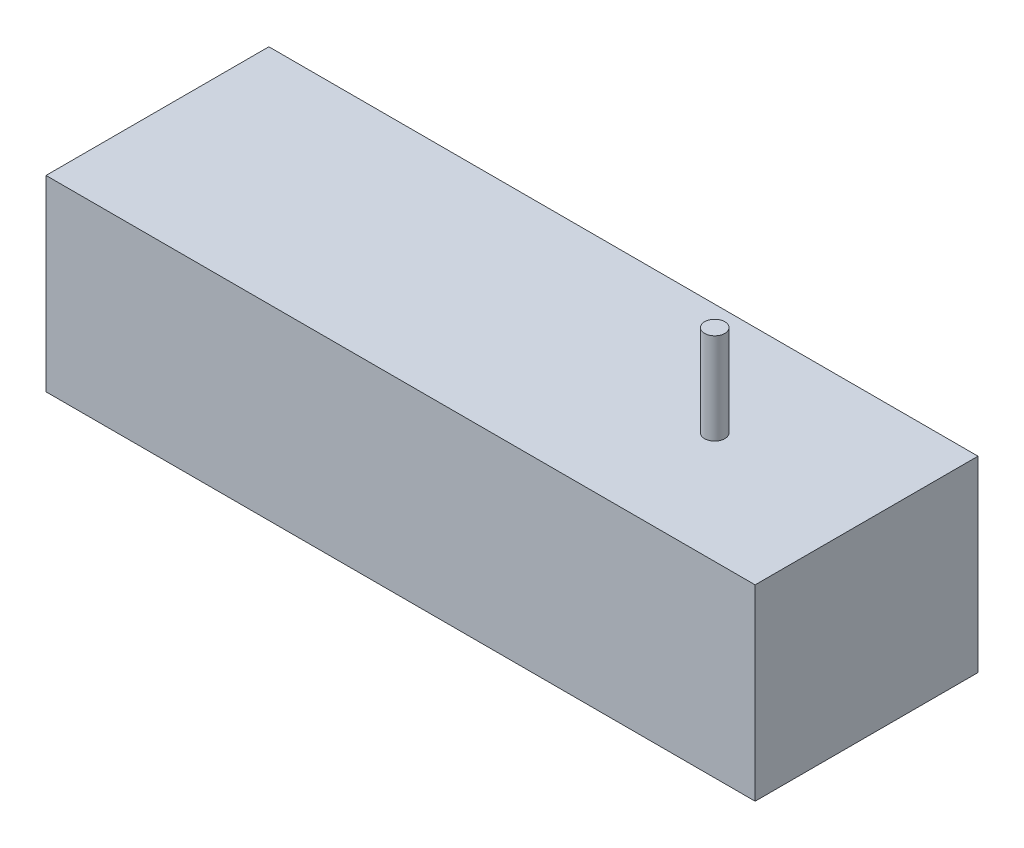
ISO-10303-21;
HEADER;
FILE_DESCRIPTION(('STEP AP214'),'2;1');
FILE_NAME('part.step','',(''),(''),'','','');
FILE_SCHEMA(('AUTOMOTIVE_DESIGN { 1 0 10303 214 1 1 1 1 }'));
ENDSEC;
DATA;
#1=APPLICATION_CONTEXT('core data for automotive mechanical design processes');
#2=APPLICATION_PROTOCOL_DEFINITION('international standard','automotive_design',2000,#1);
#3=PRODUCT_CONTEXT('',#1,'mechanical');
#4=PRODUCT('Part','Part','',(#3));
#5=PRODUCT_RELATED_PRODUCT_CATEGORY('part','',(#4));
#6=PRODUCT_DEFINITION_FORMATION('','',#4);
#7=PRODUCT_DEFINITION_CONTEXT('part definition',#1,'design');
#8=PRODUCT_DEFINITION('design','',#6,#7);
#9=PRODUCT_DEFINITION_SHAPE('','',#8);
#10=(LENGTH_UNIT() NAMED_UNIT(*) SI_UNIT(.MILLI.,.METRE.));
#11=(NAMED_UNIT(*) PLANE_ANGLE_UNIT() SI_UNIT($,.RADIAN.));
#12=(NAMED_UNIT(*) SI_UNIT($,.STERADIAN.) SOLID_ANGLE_UNIT());
#13=UNCERTAINTY_MEASURE_WITH_UNIT(LENGTH_MEASURE(1.E-05),#10,'distance_accuracy_value','');
#14=(GEOMETRIC_REPRESENTATION_CONTEXT(3) GLOBAL_UNCERTAINTY_ASSIGNED_CONTEXT((#13)) GLOBAL_UNIT_ASSIGNED_CONTEXT((#10,
#11,#12)) REPRESENTATION_CONTEXT('',''));
#15=CARTESIAN_POINT('',(0.,0.,0.));
#16=DIRECTION('',(0.,0.,1.));
#17=DIRECTION('',(1.,0.,0.));
#18=AXIS2_PLACEMENT_3D('',#15,#16,#17);
#19=CARTESIAN_POINT('',(35.,18.5,-11.));
#20=DIRECTION('',(-1.,0.,0.));
#21=DIRECTION('',(0.,0.,1.));
#22=AXIS2_PLACEMENT_3D('',#19,#20,#21);
#23=PLANE('',#22);
#24=DIRECTION('',(0.,0.,-1.));
#25=VECTOR('',#24,1.);
#26=CARTESIAN_POINT('',(35.,0.,-11.));
#27=LINE('',#26,#25);
#28=CARTESIAN_POINT('',(35.,0.,11.));
#29=VERTEX_POINT('',#28);
#30=CARTESIAN_POINT('',(35.,0.,-11.));
#31=VERTEX_POINT('',#30);
#32=EDGE_CURVE('E99',#29,#31,#27,.T.);
#33=ORIENTED_EDGE('',*,*,#32,.T.);
#34=DIRECTION('',(0.,-1.,0.));
#35=VECTOR('',#34,1.);
#36=CARTESIAN_POINT('',(35.,18.5,-11.));
#37=LINE('',#36,#35);
#38=CARTESIAN_POINT('',(35.,18.5,-11.));
#39=VERTEX_POINT('',#38);
#40=EDGE_CURVE('E11',#39,#31,#37,.T.);
#41=ORIENTED_EDGE('',*,*,#40,.F.);
#42=DIRECTION('',(0.,0.,-1.));
#43=VECTOR('',#42,1.);
#44=CARTESIAN_POINT('',(35.,18.5,-11.));
#45=LINE('',#44,#43);
#46=CARTESIAN_POINT('',(35.,18.5,11.));
#47=VERTEX_POINT('',#46);
#48=EDGE_CURVE('E87',#47,#39,#45,.T.);
#49=ORIENTED_EDGE('',*,*,#48,.F.);
#50=DIRECTION('',(0.,-1.,0.));
#51=VECTOR('',#50,1.);
#52=CARTESIAN_POINT('',(35.,18.5,11.));
#53=LINE('',#52,#51);
#54=EDGE_CURVE('E95',#47,#29,#53,.T.);
#55=ORIENTED_EDGE('',*,*,#54,.T.);
#56=EDGE_LOOP('',(#33,#41,#49,#55));
#57=FACE_BOUND('',#56,.T.);
#58=ADVANCED_FACE('F36',(#57),#23,.F.);
#59=CARTESIAN_POINT('',(-35.,18.5,-11.));
#60=DIRECTION('',(0.,0.,1.));
#61=DIRECTION('',(1.,0.,0.));
#62=AXIS2_PLACEMENT_3D('',#59,#60,#61);
#63=PLANE('',#62);
#64=DIRECTION('',(-1.,0.,0.));
#65=VECTOR('',#64,1.);
#66=CARTESIAN_POINT('',(-35.,0.,-11.));
#67=LINE('',#66,#65);
#68=CARTESIAN_POINT('',(-35.,0.,-11.));
#69=VERTEX_POINT('',#68);
#70=EDGE_CURVE('E91',#31,#69,#67,.T.);
#71=ORIENTED_EDGE('',*,*,#70,.T.);
#72=DIRECTION('',(0.,-1.,0.));
#73=VECTOR('',#72,1.);
#74=CARTESIAN_POINT('',(-35.,18.5,-11.));
#75=LINE('',#74,#73);
#76=CARTESIAN_POINT('',(-35.,18.5,-11.));
#77=VERTEX_POINT('',#76);
#78=EDGE_CURVE('E44',#77,#69,#75,.T.);
#79=ORIENTED_EDGE('',*,*,#78,.F.);
#80=DIRECTION('',(-1.,0.,0.));
#81=VECTOR('',#80,1.);
#82=CARTESIAN_POINT('',(-35.,18.5,-11.));
#83=LINE('',#82,#81);
#84=EDGE_CURVE('E82',#39,#77,#83,.T.);
#85=ORIENTED_EDGE('',*,*,#84,.F.);
#86=ORIENTED_EDGE('',*,*,#40,.T.);
#87=EDGE_LOOP('',(#71,#79,#85,#86));
#88=FACE_BOUND('',#87,.T.);
#89=ADVANCED_FACE('F90',(#88),#63,.F.);
#90=CARTESIAN_POINT('',(-35.,18.5,-11.));
#91=DIRECTION('',(1.,0.,0.));
#92=DIRECTION('',(0.,0.,-1.));
#93=AXIS2_PLACEMENT_3D('',#90,#91,#92);
#94=PLANE('',#93);
#95=DIRECTION('',(0.,0.,1.));
#96=VECTOR('',#95,1.);
#97=CARTESIAN_POINT('',(-35.,0.,-11.));
#98=LINE('',#97,#96);
#99=CARTESIAN_POINT('',(-35.,0.,11.));
#100=VERTEX_POINT('',#99);
#101=EDGE_CURVE('E69',#69,#100,#98,.T.);
#102=ORIENTED_EDGE('',*,*,#101,.T.);
#103=DIRECTION('',(0.,-1.,0.));
#104=VECTOR('',#103,1.);
#105=CARTESIAN_POINT('',(-35.,18.5,11.));
#106=LINE('',#105,#104);
#107=CARTESIAN_POINT('',(-35.,18.5,11.));
#108=VERTEX_POINT('',#107);
#109=EDGE_CURVE('E92',#108,#100,#106,.T.);
#110=ORIENTED_EDGE('',*,*,#109,.F.);
#111=DIRECTION('',(0.,0.,1.));
#112=VECTOR('',#111,1.);
#113=CARTESIAN_POINT('',(-35.,18.5,-11.));
#114=LINE('',#113,#112);
#115=EDGE_CURVE('E85',#77,#108,#114,.T.);
#116=ORIENTED_EDGE('',*,*,#115,.F.);
#117=ORIENTED_EDGE('',*,*,#78,.T.);
#118=EDGE_LOOP('',(#102,#110,#116,#117));
#119=FACE_BOUND('',#118,.T.);
#120=ADVANCED_FACE('F93',(#119),#94,.F.);
#121=CARTESIAN_POINT('',(-35.,18.5,11.));
#122=DIRECTION('',(0.,0.,-1.));
#123=DIRECTION('',(-1.,0.,0.));
#124=AXIS2_PLACEMENT_3D('',#121,#122,#123);
#125=PLANE('',#124);
#126=DIRECTION('',(1.,0.,0.));
#127=VECTOR('',#126,1.);
#128=CARTESIAN_POINT('',(-35.,0.,11.));
#129=LINE('',#128,#127);
#130=EDGE_CURVE('E75',#100,#29,#129,.T.);
#131=ORIENTED_EDGE('',*,*,#130,.T.);
#132=ORIENTED_EDGE('',*,*,#54,.F.);
#133=DIRECTION('',(1.,0.,0.));
#134=VECTOR('',#133,1.);
#135=CARTESIAN_POINT('',(-35.,18.5,11.));
#136=LINE('',#135,#134);
#137=EDGE_CURVE('E52',#108,#47,#136,.T.);
#138=ORIENTED_EDGE('',*,*,#137,.F.);
#139=ORIENTED_EDGE('',*,*,#109,.T.);
#140=EDGE_LOOP('',(#131,#132,#138,#139));
#141=FACE_BOUND('',#140,.T.);
#142=ADVANCED_FACE('F107',(#141),#125,.F.);
#143=CARTESIAN_POINT('',(0.,18.5,0.));
#144=DIRECTION('',(0.,1.,0.));
#145=DIRECTION('',(0.,0.,1.));
#146=AXIS2_PLACEMENT_3D('',#143,#144,#145);
#147=PLANE('',#146);
#148=CARTESIAN_POINT('',(20.0113209475176,18.5,0.));
#149=DIRECTION('',(0.,1.,0.));
#150=DIRECTION('',(0.,0.,1.));
#151=AXIS2_PLACEMENT_3D('',#148,#149,#150);
#152=CIRCLE('',#151,1.);
#153=CARTESIAN_POINT('',(20.0113209475176,18.5,1.));
#154=VERTEX_POINT('',#153);
#155=EDGE_CURVE('E113',#154,#154,#152,.T.);
#156=ORIENTED_EDGE('',*,*,#155,.F.);
#157=EDGE_LOOP('',(#156));
#158=FACE_BOUND('',#157,.T.);
#159=ORIENTED_EDGE('',*,*,#48,.T.);
#160=ORIENTED_EDGE('',*,*,#84,.T.);
#161=ORIENTED_EDGE('',*,*,#115,.T.);
#162=ORIENTED_EDGE('',*,*,#137,.T.);
#163=EDGE_LOOP('',(#159,#160,#161,#162));
#164=FACE_BOUND('',#163,.T.);
#165=ADVANCED_FACE('F83',(#158,#164),#147,.T.);
#166=CARTESIAN_POINT('',(0.,0.,0.));
#167=DIRECTION('',(0.,1.,0.));
#168=DIRECTION('',(0.,0.,1.));
#169=AXIS2_PLACEMENT_3D('',#166,#167,#168);
#170=PLANE('',#169);
#171=ORIENTED_EDGE('',*,*,#32,.F.);
#172=ORIENTED_EDGE('',*,*,#130,.F.);
#173=ORIENTED_EDGE('',*,*,#101,.F.);
#174=ORIENTED_EDGE('',*,*,#70,.F.);
#175=EDGE_LOOP('',(#171,#172,#173,#174));
#176=FACE_BOUND('',#175,.T.);
#177=ADVANCED_FACE('F110',(#176),#170,.F.);
#178=CARTESIAN_POINT('',(20.0113209475176,27.5,0.));
#179=DIRECTION('',(0.,-1.,0.));
#180=DIRECTION('',(0.,0.,-1.));
#181=AXIS2_PLACEMENT_3D('',#178,#179,#180);
#182=CYLINDRICAL_SURFACE('',#181,1.);
#183=CARTESIAN_POINT('',(20.0113209475176,27.5,0.));
#184=DIRECTION('',(0.,1.,0.));
#185=DIRECTION('',(0.,0.,1.));
#186=AXIS2_PLACEMENT_3D('',#183,#184,#185);
#187=CIRCLE('',#186,1.);
#188=CARTESIAN_POINT('',(20.0113209475176,27.5,1.));
#189=VERTEX_POINT('',#188);
#190=EDGE_CURVE('E102',#189,#189,#187,.T.);
#191=ORIENTED_EDGE('',*,*,#190,.F.);
#192=EDGE_LOOP('',(#191));
#193=FACE_BOUND('',#192,.T.);
#194=ORIENTED_EDGE('',*,*,#155,.T.);
#195=EDGE_LOOP('',(#194));
#196=FACE_BOUND('',#195,.T.);
#197=ADVANCED_FACE('F121',(#193,#196),#182,.T.);
#198=CARTESIAN_POINT('',(20.0113209475176,27.5,0.));
#199=DIRECTION('',(0.,1.,0.));
#200=DIRECTION('',(0.,0.,1.));
#201=AXIS2_PLACEMENT_3D('',#198,#199,#200);
#202=PLANE('',#201);
#203=ORIENTED_EDGE('',*,*,#190,.T.);
#204=EDGE_LOOP('',(#203));
#205=FACE_BOUND('',#204,.T.);
#206=ADVANCED_FACE('F119',(#205),#202,.T.);
#207=CLOSED_SHELL('',(#58,#89,#120,#142,#165,#177,#197,#206));
#208=MANIFOLD_SOLID_BREP('B2',#207);
#209=ADVANCED_BREP_SHAPE_REPRESENTATION('',(#18,#208),#14);
#210=SHAPE_DEFINITION_REPRESENTATION(#9,#209);
ENDSEC;
END-ISO-10303-21;
